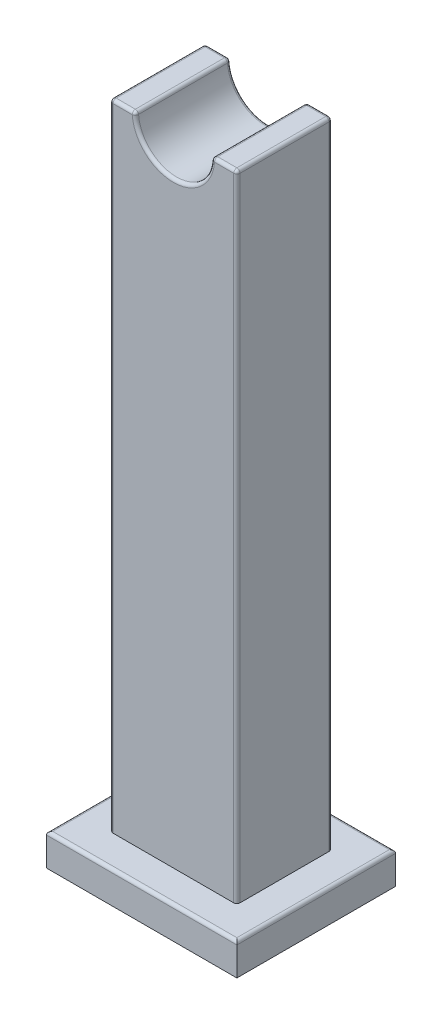
ISO-10303-21;
HEADER;
FILE_DESCRIPTION(('STEP AP214'),'2;1');
FILE_NAME('part.step','',(''),(''),'','','');
FILE_SCHEMA(('AUTOMOTIVE_DESIGN { 1 0 10303 214 1 1 1 1 }'));
ENDSEC;
DATA;
#1=APPLICATION_CONTEXT('core data for automotive mechanical design processes');
#2=APPLICATION_PROTOCOL_DEFINITION('international standard','automotive_design',2000,#1);
#3=PRODUCT_CONTEXT('',#1,'mechanical');
#4=PRODUCT('Part','Part','',(#3));
#5=PRODUCT_RELATED_PRODUCT_CATEGORY('part','',(#4));
#6=PRODUCT_DEFINITION_FORMATION('','',#4);
#7=PRODUCT_DEFINITION_CONTEXT('part definition',#1,'design');
#8=PRODUCT_DEFINITION('design','',#6,#7);
#9=PRODUCT_DEFINITION_SHAPE('','',#8);
#10=(LENGTH_UNIT() NAMED_UNIT(*) SI_UNIT(.MILLI.,.METRE.));
#11=(NAMED_UNIT(*) PLANE_ANGLE_UNIT() SI_UNIT($,.RADIAN.));
#12=(NAMED_UNIT(*) SI_UNIT($,.STERADIAN.) SOLID_ANGLE_UNIT());
#13=UNCERTAINTY_MEASURE_WITH_UNIT(LENGTH_MEASURE(1.E-05),#10,'distance_accuracy_value','');
#14=(GEOMETRIC_REPRESENTATION_CONTEXT(3) GLOBAL_UNCERTAINTY_ASSIGNED_CONTEXT((#13)) GLOBAL_UNIT_ASSIGNED_CONTEXT((#10,
#11,#12)) REPRESENTATION_CONTEXT('',''));
#15=CARTESIAN_POINT('',(0.,0.,0.));
#16=DIRECTION('',(0.,0.,1.));
#17=DIRECTION('',(1.,0.,0.));
#18=AXIS2_PLACEMENT_3D('',#15,#16,#17);
#19=CARTESIAN_POINT('',(-10.,0.,15.));
#20=DIRECTION('',(1.,0.,0.));
#21=DIRECTION('',(0.,1.,0.));
#22=AXIS2_PLACEMENT_3D('',#19,#20,#21);
#23=PLANE('',#22);
#24=DIRECTION('',(0.,0.,-1.));
#25=VECTOR('',#24,1.);
#26=CARTESIAN_POINT('',(-10.,-0.499999999999998,15.));
#27=LINE('',#26,#25);
#28=CARTESIAN_POINT('',(-10.,-0.499999999999998,14.5));
#29=VERTEX_POINT('',#28);
#30=CARTESIAN_POINT('',(-10.,-0.499999999999998,0.5));
#31=VERTEX_POINT('',#30);
#32=EDGE_CURVE('E242',#29,#31,#27,.T.);
#33=ORIENTED_EDGE('',*,*,#32,.T.);
#34=DIRECTION('',(0.,-1.,0.));
#35=VECTOR('',#34,1.);
#36=CARTESIAN_POINT('',(-10.,0.,0.5));
#37=LINE('',#36,#35);
#38=CARTESIAN_POINT('',(-9.99999999999999,-100.,0.5));
#39=VERTEX_POINT('',#38);
#40=EDGE_CURVE('E245',#31,#39,#37,.T.);
#41=ORIENTED_EDGE('',*,*,#40,.T.);
#42=DIRECTION('',(0.,0.,-1.));
#43=VECTOR('',#42,1.);
#44=CARTESIAN_POINT('',(-9.99999999999999,-100.,15.));
#45=LINE('',#44,#43);
#46=CARTESIAN_POINT('',(-9.99999999999999,-100.,14.5));
#47=VERTEX_POINT('',#46);
#48=EDGE_CURVE('E235',#47,#39,#45,.T.);
#49=ORIENTED_EDGE('',*,*,#48,.F.);
#50=DIRECTION('',(0.,-1.,0.));
#51=VECTOR('',#50,1.);
#52=CARTESIAN_POINT('',(-10.,0.,14.5));
#53=LINE('',#52,#51);
#54=EDGE_CURVE('E239',#47,#29,#53,.F.);
#55=ORIENTED_EDGE('',*,*,#54,.T.);
#56=EDGE_LOOP('',(#33,#41,#49,#55));
#57=FACE_BOUND('',#56,.T.);
#58=ADVANCED_FACE('F39',(#57),#23,.F.);
#59=CARTESIAN_POINT('',(10.,0.,15.));
#60=DIRECTION('',(-1.,0.,0.));
#61=DIRECTION('',(0.,-1.,0.));
#62=AXIS2_PLACEMENT_3D('',#59,#60,#61);
#63=PLANE('',#62);
#64=DIRECTION('',(0.,0.,-1.));
#65=VECTOR('',#64,1.);
#66=CARTESIAN_POINT('',(10.,-100.,15.));
#67=LINE('',#66,#65);
#68=CARTESIAN_POINT('',(10.,-100.,14.5));
#69=VERTEX_POINT('',#68);
#70=CARTESIAN_POINT('',(10.,-100.,0.5));
#71=VERTEX_POINT('',#70);
#72=EDGE_CURVE('E230',#69,#71,#67,.T.);
#73=ORIENTED_EDGE('',*,*,#72,.T.);
#74=DIRECTION('',(0.,1.,0.));
#75=VECTOR('',#74,1.);
#76=CARTESIAN_POINT('',(10.,0.,0.5));
#77=LINE('',#76,#75);
#78=CARTESIAN_POINT('',(10.,-0.499999999999998,0.5));
#79=VERTEX_POINT('',#78);
#80=EDGE_CURVE('E324',#71,#79,#77,.T.);
#81=ORIENTED_EDGE('',*,*,#80,.T.);
#82=DIRECTION('',(0.,0.,-1.));
#83=VECTOR('',#82,1.);
#84=CARTESIAN_POINT('',(10.,-0.499999999999998,15.));
#85=LINE('',#84,#83);
#86=CARTESIAN_POINT('',(10.,-0.499999999999998,14.5));
#87=VERTEX_POINT('',#86);
#88=EDGE_CURVE('E321',#79,#87,#85,.F.);
#89=ORIENTED_EDGE('',*,*,#88,.T.);
#90=DIRECTION('',(0.,1.,0.));
#91=VECTOR('',#90,1.);
#92=CARTESIAN_POINT('',(10.,-100.,14.5));
#93=LINE('',#92,#91);
#94=EDGE_CURVE('E318',#87,#69,#93,.F.);
#95=ORIENTED_EDGE('',*,*,#94,.T.);
#96=EDGE_LOOP('',(#73,#81,#89,#95));
#97=FACE_BOUND('',#96,.T.);
#98=ADVANCED_FACE('F487',(#97),#63,.F.);
#99=CARTESIAN_POINT('',(6.,0.,15.));
#100=DIRECTION('',(0.,-1.,0.));
#101=DIRECTION('',(0.,0.,-1.));
#102=AXIS2_PLACEMENT_3D('',#99,#100,#101);
#103=PLANE('',#102);
#104=DIRECTION('',(0.,0.,-1.));
#105=VECTOR('',#104,1.);
#106=CARTESIAN_POINT('',(9.5,0.,15.));
#107=LINE('',#106,#105);
#108=CARTESIAN_POINT('',(9.5,0.,14.5));
#109=VERTEX_POINT('',#108);
#110=CARTESIAN_POINT('',(9.5,0.,0.5));
#111=VERTEX_POINT('',#110);
#112=EDGE_CURVE('E267',#109,#111,#107,.T.);
#113=ORIENTED_EDGE('',*,*,#112,.T.);
#114=DIRECTION('',(-1.,0.,0.));
#115=VECTOR('',#114,1.);
#116=CARTESIAN_POINT('',(6.,0.,0.5));
#117=LINE('',#116,#115);
#118=CARTESIAN_POINT('',(6.48074069840786,0.,0.5));
#119=VERTEX_POINT('',#118);
#120=EDGE_CURVE('E273',#111,#119,#117,.T.);
#121=ORIENTED_EDGE('',*,*,#120,.T.);
#122=DIRECTION('',(0.,0.,-1.));
#123=VECTOR('',#122,1.);
#124=CARTESIAN_POINT('',(6.48074069840786,0.,15.));
#125=LINE('',#124,#123);
#126=CARTESIAN_POINT('',(6.48074069840786,0.,14.5));
#127=VERTEX_POINT('',#126);
#128=EDGE_CURVE('E270',#119,#127,#125,.F.);
#129=ORIENTED_EDGE('',*,*,#128,.T.);
#130=DIRECTION('',(-1.,0.,0.));
#131=VECTOR('',#130,1.);
#132=CARTESIAN_POINT('',(10.,0.,14.5));
#133=LINE('',#132,#131);
#134=EDGE_CURVE('E264',#127,#109,#133,.F.);
#135=ORIENTED_EDGE('',*,*,#134,.T.);
#136=EDGE_LOOP('',(#113,#121,#129,#135));
#137=FACE_BOUND('',#136,.T.);
#138=ADVANCED_FACE('F493',(#137),#103,.F.);
#139=CARTESIAN_POINT('',(0.,0.,15.));
#140=DIRECTION('',(0.,0.,-1.));
#141=DIRECTION('',(-1.,0.,0.));
#142=AXIS2_PLACEMENT_3D('',#139,#140,#141);
#143=CYLINDRICAL_SURFACE('',#142,6.);
#144=CARTESIAN_POINT('',(0.,0.,0.5));
#145=DIRECTION('',(0.,0.,1.));
#146=DIRECTION('',(1.,0.,0.));
#147=AXIS2_PLACEMENT_3D('',#144,#145,#146);
#148=CIRCLE('',#147,6.);
#149=CARTESIAN_POINT('',(5.98222218314572,-0.461538461538459,0.5));
#150=VERTEX_POINT('',#149);
#151=CARTESIAN_POINT('',(-5.98222218314572,-0.461538461538459,0.5));
#152=VERTEX_POINT('',#151);
#153=EDGE_CURVE('E311',#150,#152,#148,.F.);
#154=ORIENTED_EDGE('',*,*,#153,.T.);
#155=DIRECTION('',(0.,0.,-1.));
#156=VECTOR('',#155,1.);
#157=CARTESIAN_POINT('',(-5.98222218314572,-0.461538461538459,15.));
#158=LINE('',#157,#156);
#159=CARTESIAN_POINT('',(-5.98222218314572,-0.461538461538459,14.5));
#160=VERTEX_POINT('',#159);
#161=EDGE_CURVE('E314',#152,#160,#158,.F.);
#162=ORIENTED_EDGE('',*,*,#161,.T.);
#163=CARTESIAN_POINT('',(0.,0.,14.5));
#164=DIRECTION('',(0.,0.,1.));
#165=DIRECTION('',(1.,0.,0.));
#166=AXIS2_PLACEMENT_3D('',#163,#164,#165);
#167=CIRCLE('',#166,6.);
#168=CARTESIAN_POINT('',(5.98222218314572,-0.461538461538459,14.5));
#169=VERTEX_POINT('',#168);
#170=EDGE_CURVE('E305',#160,#169,#167,.T.);
#171=ORIENTED_EDGE('',*,*,#170,.T.);
#172=DIRECTION('',(0.,0.,-1.));
#173=VECTOR('',#172,1.);
#174=CARTESIAN_POINT('',(5.98222218314572,-0.461538461538459,15.));
#175=LINE('',#174,#173);
#176=EDGE_CURVE('E308',#169,#150,#175,.T.);
#177=ORIENTED_EDGE('',*,*,#176,.T.);
#178=EDGE_LOOP('',(#154,#162,#171,#177));
#179=FACE_BOUND('',#178,.T.);
#180=ADVANCED_FACE('F636',(#179),#143,.F.);
#181=CARTESIAN_POINT('',(-10.,0.,15.));
#182=DIRECTION('',(0.,-1.,0.));
#183=DIRECTION('',(0.,0.,-1.));
#184=AXIS2_PLACEMENT_3D('',#181,#182,#183);
#185=PLANE('',#184);
#186=DIRECTION('',(-1.,0.,0.));
#187=VECTOR('',#186,1.);
#188=CARTESIAN_POINT('',(-10.,0.,0.5));
#189=LINE('',#188,#187);
#190=CARTESIAN_POINT('',(-6.48074069840786,0.,0.5));
#191=VERTEX_POINT('',#190);
#192=CARTESIAN_POINT('',(-9.5,0.,0.5));
#193=VERTEX_POINT('',#192);
#194=EDGE_CURVE('E295',#191,#193,#189,.T.);
#195=ORIENTED_EDGE('',*,*,#194,.T.);
#196=DIRECTION('',(0.,0.,-1.));
#197=VECTOR('',#196,1.);
#198=CARTESIAN_POINT('',(-9.5,0.,15.));
#199=LINE('',#198,#197);
#200=CARTESIAN_POINT('',(-9.5,0.,14.5));
#201=VERTEX_POINT('',#200);
#202=EDGE_CURVE('E302',#193,#201,#199,.F.);
#203=ORIENTED_EDGE('',*,*,#202,.T.);
#204=DIRECTION('',(-1.,0.,0.));
#205=VECTOR('',#204,1.);
#206=CARTESIAN_POINT('',(-6.,0.,14.5));
#207=LINE('',#206,#205);
#208=CARTESIAN_POINT('',(-6.48074069840786,0.,14.5));
#209=VERTEX_POINT('',#208);
#210=EDGE_CURVE('E298',#201,#209,#207,.F.);
#211=ORIENTED_EDGE('',*,*,#210,.T.);
#212=DIRECTION('',(0.,0.,-1.));
#213=VECTOR('',#212,1.);
#214=CARTESIAN_POINT('',(-6.48074069840786,0.,15.));
#215=LINE('',#214,#213);
#216=EDGE_CURVE('E292',#209,#191,#215,.T.);
#217=ORIENTED_EDGE('',*,*,#216,.T.);
#218=EDGE_LOOP('',(#195,#203,#211,#217));
#219=FACE_BOUND('',#218,.T.);
#220=ADVANCED_FACE('F655',(#219),#185,.F.);
#221=CARTESIAN_POINT('',(0.,0.,15.));
#222=DIRECTION('',(0.,0.,1.));
#223=DIRECTION('',(1.,0.,0.));
#224=AXIS2_PLACEMENT_3D('',#221,#222,#223);
#225=PLANE('',#224);
#226=DIRECTION('',(-1.,0.,0.));
#227=VECTOR('',#226,1.);
#228=CARTESIAN_POINT('',(-10.,-0.499999999999998,15.));
#229=LINE('',#228,#227);
#230=CARTESIAN_POINT('',(-6.48074069840786,-0.499999999999998,15.));
#231=VERTEX_POINT('',#230);
#232=CARTESIAN_POINT('',(-9.5,-0.499999999999998,15.));
#233=VERTEX_POINT('',#232);
#234=EDGE_CURVE('E286',#231,#233,#229,.T.);
#235=ORIENTED_EDGE('',*,*,#234,.T.);
#236=DIRECTION('',(0.,-1.,0.));
#237=VECTOR('',#236,1.);
#238=CARTESIAN_POINT('',(-9.49999999999999,-100.,15.));
#239=LINE('',#238,#237);
#240=CARTESIAN_POINT('',(-9.49999999999999,-100.,15.));
#241=VERTEX_POINT('',#240);
#242=EDGE_CURVE('E289',#233,#241,#239,.T.);
#243=ORIENTED_EDGE('',*,*,#242,.T.);
#244=DIRECTION('',(1.,0.,0.));
#245=VECTOR('',#244,1.);
#246=CARTESIAN_POINT('',(-9.99999999999999,-100.,15.));
#247=LINE('',#246,#245);
#248=CARTESIAN_POINT('',(9.50000000000001,-100.,15.));
#249=VERTEX_POINT('',#248);
#250=EDGE_CURVE('E222',#241,#249,#247,.T.);
#251=ORIENTED_EDGE('',*,*,#250,.T.);
#252=DIRECTION('',(0.,1.,0.));
#253=VECTOR('',#252,1.);
#254=CARTESIAN_POINT('',(9.5,0.,15.));
#255=LINE('',#254,#253);
#256=CARTESIAN_POINT('',(9.5,-0.499999999999998,15.));
#257=VERTEX_POINT('',#256);
#258=EDGE_CURVE('E277',#249,#257,#255,.T.);
#259=ORIENTED_EDGE('',*,*,#258,.T.);
#260=DIRECTION('',(-1.,0.,0.));
#261=VECTOR('',#260,1.);
#262=CARTESIAN_POINT('',(6.,-0.499999999999998,15.));
#263=LINE('',#262,#261);
#264=CARTESIAN_POINT('',(6.48074069840786,-0.499999999999998,15.));
#265=VERTEX_POINT('',#264);
#266=EDGE_CURVE('E280',#257,#265,#263,.T.);
#267=ORIENTED_EDGE('',*,*,#266,.T.);
#268=CARTESIAN_POINT('',(0.,0.,15.));
#269=DIRECTION('',(0.,0.,1.));
#270=DIRECTION('',(1.,0.,0.));
#271=AXIS2_PLACEMENT_3D('',#268,#269,#270);
#272=CIRCLE('',#271,6.5);
#273=EDGE_CURVE('E283',#265,#231,#272,.F.);
#274=ORIENTED_EDGE('',*,*,#273,.T.);
#275=EDGE_LOOP('',(#235,#243,#251,#259,#267,#274));
#276=FACE_BOUND('',#275,.T.);
#277=ADVANCED_FACE('F601',(#276),#225,.T.);
#278=CARTESIAN_POINT('',(0.,0.,0.));
#279=DIRECTION('',(0.,0.,1.));
#280=DIRECTION('',(1.,0.,0.));
#281=AXIS2_PLACEMENT_3D('',#278,#279,#280);
#282=PLANE('',#281);
#283=DIRECTION('',(1.,0.,0.));
#284=VECTOR('',#283,1.);
#285=CARTESIAN_POINT('',(-9.99999999999999,-100.,0.));
#286=LINE('',#285,#284);
#287=CARTESIAN_POINT('',(-9.49999999999999,-100.,0.));
#288=VERTEX_POINT('',#287);
#289=CARTESIAN_POINT('',(9.50000000000001,-100.,0.));
#290=VERTEX_POINT('',#289);
#291=EDGE_CURVE('E217',#288,#290,#286,.T.);
#292=ORIENTED_EDGE('',*,*,#291,.F.);
#293=DIRECTION('',(0.,-1.,0.));
#294=VECTOR('',#293,1.);
#295=CARTESIAN_POINT('',(-9.5,0.,0.));
#296=LINE('',#295,#294);
#297=CARTESIAN_POINT('',(-9.5,-0.499999999999998,0.));
#298=VERTEX_POINT('',#297);
#299=EDGE_CURVE('E261',#288,#298,#296,.F.);
#300=ORIENTED_EDGE('',*,*,#299,.T.);
#301=DIRECTION('',(-1.,0.,0.));
#302=VECTOR('',#301,1.);
#303=CARTESIAN_POINT('',(0.,-0.499999999999998,0.));
#304=LINE('',#303,#302);
#305=CARTESIAN_POINT('',(-6.48074069840786,-0.499999999999998,0.));
#306=VERTEX_POINT('',#305);
#307=EDGE_CURVE('E258',#298,#306,#304,.F.);
#308=ORIENTED_EDGE('',*,*,#307,.T.);
#309=CARTESIAN_POINT('',(0.,0.,0.));
#310=DIRECTION('',(0.,0.,1.));
#311=DIRECTION('',(1.,0.,0.));
#312=AXIS2_PLACEMENT_3D('',#309,#310,#311);
#313=CIRCLE('',#312,6.5);
#314=CARTESIAN_POINT('',(6.48074069840786,-0.499999999999998,0.));
#315=VERTEX_POINT('',#314);
#316=EDGE_CURVE('E255',#306,#315,#313,.T.);
#317=ORIENTED_EDGE('',*,*,#316,.T.);
#318=DIRECTION('',(-1.,0.,0.));
#319=VECTOR('',#318,1.);
#320=CARTESIAN_POINT('',(0.,-0.499999999999998,0.));
#321=LINE('',#320,#319);
#322=CARTESIAN_POINT('',(9.5,-0.499999999999998,0.));
#323=VERTEX_POINT('',#322);
#324=EDGE_CURVE('E252',#315,#323,#321,.F.);
#325=ORIENTED_EDGE('',*,*,#324,.T.);
#326=DIRECTION('',(0.,1.,0.));
#327=VECTOR('',#326,1.);
#328=CARTESIAN_POINT('',(9.5,0.,0.));
#329=LINE('',#328,#327);
#330=EDGE_CURVE('E249',#323,#290,#329,.F.);
#331=ORIENTED_EDGE('',*,*,#330,.T.);
#332=EDGE_LOOP('',(#292,#300,#308,#317,#325,#331));
#333=FACE_BOUND('',#332,.T.);
#334=ADVANCED_FACE('F620',(#333),#282,.F.);
#335=CARTESIAN_POINT('',(-15.,-105.,20.));
#336=DIRECTION('',(1.,0.,0.));
#337=DIRECTION('',(0.,0.,-1.));
#338=AXIS2_PLACEMENT_3D('',#335,#336,#337);
#339=PLANE('',#338);
#340=DIRECTION('',(0.,1.,0.));
#341=VECTOR('',#340,1.);
#342=CARTESIAN_POINT('',(-15.,-105.,20.));
#343=LINE('',#342,#341);
#344=CARTESIAN_POINT('',(-15.,-105.,20.));
#345=VERTEX_POINT('',#344);
#346=CARTESIAN_POINT('',(-15.,-100.5,20.));
#347=VERTEX_POINT('',#346);
#348=EDGE_CURVE('E908',#345,#347,#343,.T.);
#349=ORIENTED_EDGE('',*,*,#348,.T.);
#350=DIRECTION('',(0.,0.,-1.));
#351=VECTOR('',#350,1.);
#352=CARTESIAN_POINT('',(-15.,-100.5,20.));
#353=LINE('',#352,#351);
#354=CARTESIAN_POINT('',(-15.,-100.5,-5.));
#355=VERTEX_POINT('',#354);
#356=EDGE_CURVE('E215',#347,#355,#353,.T.);
#357=ORIENTED_EDGE('',*,*,#356,.T.);
#358=DIRECTION('',(0.,1.,0.));
#359=VECTOR('',#358,1.);
#360=CARTESIAN_POINT('',(-15.,-105.,-5.));
#361=LINE('',#360,#359);
#362=CARTESIAN_POINT('',(-15.,-105.,-5.));
#363=VERTEX_POINT('',#362);
#364=EDGE_CURVE('E194',#363,#355,#361,.T.);
#365=ORIENTED_EDGE('',*,*,#364,.F.);
#366=DIRECTION('',(0.,0.,-1.));
#367=VECTOR('',#366,1.);
#368=CARTESIAN_POINT('',(-15.,-105.,20.));
#369=LINE('',#368,#367);
#370=EDGE_CURVE('E200',#345,#363,#369,.T.);
#371=ORIENTED_EDGE('',*,*,#370,.F.);
#372=EDGE_LOOP('',(#349,#357,#365,#371));
#373=FACE_BOUND('',#372,.T.);
#374=ADVANCED_FACE('F213',(#373),#339,.F.);
#375=CARTESIAN_POINT('',(-15.,-105.,-5.));
#376=DIRECTION('',(0.,0.,1.));
#377=DIRECTION('',(1.,0.,0.));
#378=AXIS2_PLACEMENT_3D('',#375,#376,#377);
#379=PLANE('',#378);
#380=ORIENTED_EDGE('',*,*,#364,.T.);
#381=DIRECTION('',(1.,0.,0.));
#382=VECTOR('',#381,1.);
#383=CARTESIAN_POINT('',(-15.,-100.5,-5.));
#384=LINE('',#383,#382);
#385=CARTESIAN_POINT('',(15.,-100.5,-5.));
#386=VERTEX_POINT('',#385);
#387=EDGE_CURVE('E65',#355,#386,#384,.T.);
#388=ORIENTED_EDGE('',*,*,#387,.T.);
#389=DIRECTION('',(0.,1.,0.));
#390=VECTOR('',#389,1.);
#391=CARTESIAN_POINT('',(15.,-105.,-5.));
#392=LINE('',#391,#390);
#393=CARTESIAN_POINT('',(15.,-105.,-5.));
#394=VERTEX_POINT('',#393);
#395=EDGE_CURVE('E195',#394,#386,#392,.T.);
#396=ORIENTED_EDGE('',*,*,#395,.F.);
#397=DIRECTION('',(1.,0.,0.));
#398=VECTOR('',#397,1.);
#399=CARTESIAN_POINT('',(-15.,-105.,-5.));
#400=LINE('',#399,#398);
#401=EDGE_CURVE('E190',#363,#394,#400,.T.);
#402=ORIENTED_EDGE('',*,*,#401,.F.);
#403=EDGE_LOOP('',(#380,#388,#396,#402));
#404=FACE_BOUND('',#403,.T.);
#405=ADVANCED_FACE('F192',(#404),#379,.F.);
#406=CARTESIAN_POINT('',(15.,-105.,20.));
#407=DIRECTION('',(-1.,0.,0.));
#408=DIRECTION('',(0.,0.,1.));
#409=AXIS2_PLACEMENT_3D('',#406,#407,#408);
#410=PLANE('',#409);
#411=ORIENTED_EDGE('',*,*,#395,.T.);
#412=DIRECTION('',(0.,0.,1.));
#413=VECTOR('',#412,1.);
#414=CARTESIAN_POINT('',(15.,-100.5,20.));
#415=LINE('',#414,#413);
#416=CARTESIAN_POINT('',(15.,-100.5,20.));
#417=VERTEX_POINT('',#416);
#418=EDGE_CURVE('E57',#386,#417,#415,.T.);
#419=ORIENTED_EDGE('',*,*,#418,.T.);
#420=DIRECTION('',(0.,1.,0.));
#421=VECTOR('',#420,1.);
#422=CARTESIAN_POINT('',(15.,-105.,20.));
#423=LINE('',#422,#421);
#424=CARTESIAN_POINT('',(15.,-105.,20.));
#425=VERTEX_POINT('',#424);
#426=EDGE_CURVE('E224',#425,#417,#423,.T.);
#427=ORIENTED_EDGE('',*,*,#426,.F.);
#428=DIRECTION('',(0.,0.,1.));
#429=VECTOR('',#428,1.);
#430=CARTESIAN_POINT('',(15.,-105.,20.));
#431=LINE('',#430,#429);
#432=EDGE_CURVE('E199',#394,#425,#431,.T.);
#433=ORIENTED_EDGE('',*,*,#432,.F.);
#434=EDGE_LOOP('',(#411,#419,#427,#433));
#435=FACE_BOUND('',#434,.T.);
#436=ADVANCED_FACE('F708',(#435),#410,.F.);
#437=CARTESIAN_POINT('',(-15.,-105.,20.));
#438=DIRECTION('',(0.,0.,-1.));
#439=DIRECTION('',(-1.,0.,0.));
#440=AXIS2_PLACEMENT_3D('',#437,#438,#439);
#441=PLANE('',#440);
#442=ORIENTED_EDGE('',*,*,#426,.T.);
#443=DIRECTION('',(-1.,0.,0.));
#444=VECTOR('',#443,1.);
#445=CARTESIAN_POINT('',(-15.,-100.5,20.));
#446=LINE('',#445,#444);
#447=EDGE_CURVE('E346',#417,#347,#446,.T.);
#448=ORIENTED_EDGE('',*,*,#447,.T.);
#449=ORIENTED_EDGE('',*,*,#348,.F.);
#450=DIRECTION('',(-1.,0.,0.));
#451=VECTOR('',#450,1.);
#452=CARTESIAN_POINT('',(-15.,-105.,20.));
#453=LINE('',#452,#451);
#454=EDGE_CURVE('E205',#425,#345,#453,.T.);
#455=ORIENTED_EDGE('',*,*,#454,.F.);
#456=EDGE_LOOP('',(#442,#448,#449,#455));
#457=FACE_BOUND('',#456,.T.);
#458=ADVANCED_FACE('F717',(#457),#441,.F.);
#459=CARTESIAN_POINT('',(0.,-105.,0.));
#460=DIRECTION('',(0.,-1.,0.));
#461=DIRECTION('',(0.,0.,-1.));
#462=AXIS2_PLACEMENT_3D('',#459,#460,#461);
#463=PLANE('',#462);
#464=ORIENTED_EDGE('',*,*,#370,.T.);
#465=ORIENTED_EDGE('',*,*,#401,.T.);
#466=ORIENTED_EDGE('',*,*,#432,.T.);
#467=ORIENTED_EDGE('',*,*,#454,.T.);
#468=EDGE_LOOP('',(#464,#465,#466,#467));
#469=FACE_BOUND('',#468,.T.);
#470=ADVANCED_FACE('F203',(#469),#463,.T.);
#471=CARTESIAN_POINT('',(0.,-100.,0.));
#472=DIRECTION('',(0.,-1.,0.));
#473=DIRECTION('',(0.,0.,-1.));
#474=AXIS2_PLACEMENT_3D('',#471,#472,#473);
#475=PLANE('',#474);
#476=DIRECTION('',(1.,0.,0.));
#477=VECTOR('',#476,1.);
#478=CARTESIAN_POINT('',(0.,-100.,-4.5));
#479=LINE('',#478,#477);
#480=CARTESIAN_POINT('',(14.5,-100.,-4.5));
#481=VERTEX_POINT('',#480);
#482=CARTESIAN_POINT('',(-14.5,-100.,-4.5));
#483=VERTEX_POINT('',#482);
#484=EDGE_CURVE('E335',#481,#483,#479,.F.);
#485=ORIENTED_EDGE('',*,*,#484,.T.);
#486=DIRECTION('',(0.,0.,-1.));
#487=VECTOR('',#486,1.);
#488=CARTESIAN_POINT('',(-14.5,-100.,0.));
#489=LINE('',#488,#487);
#490=CARTESIAN_POINT('',(-14.5,-100.,19.5));
#491=VERTEX_POINT('',#490);
#492=EDGE_CURVE('E338',#483,#491,#489,.F.);
#493=ORIENTED_EDGE('',*,*,#492,.T.);
#494=DIRECTION('',(-1.,0.,0.));
#495=VECTOR('',#494,1.);
#496=CARTESIAN_POINT('',(0.,-100.,19.5));
#497=LINE('',#496,#495);
#498=CARTESIAN_POINT('',(14.5,-100.,19.5));
#499=VERTEX_POINT('',#498);
#500=EDGE_CURVE('E329',#491,#499,#497,.F.);
#501=ORIENTED_EDGE('',*,*,#500,.T.);
#502=DIRECTION('',(0.,0.,1.));
#503=VECTOR('',#502,1.);
#504=CARTESIAN_POINT('',(14.5,-100.,0.));
#505=LINE('',#504,#503);
#506=EDGE_CURVE('E332',#499,#481,#505,.F.);
#507=ORIENTED_EDGE('',*,*,#506,.T.);
#508=EDGE_LOOP('',(#485,#493,#501,#507));
#509=FACE_BOUND('',#508,.T.);
#510=ORIENTED_EDGE('',*,*,#250,.F.);
#511=CARTESIAN_POINT('',(-9.49999999999999,-100.,14.5));
#512=DIRECTION('',(0.,-1.,0.));
#513=DIRECTION('',(0.,0.,-1.));
#514=AXIS2_PLACEMENT_3D('',#511,#512,#513);
#515=CIRCLE('',#514,0.5);
#516=EDGE_CURVE('E352',#241,#47,#515,.T.);
#517=ORIENTED_EDGE('',*,*,#516,.T.);
#518=ORIENTED_EDGE('',*,*,#48,.T.);
#519=CARTESIAN_POINT('',(-9.49999999999999,-100.,0.5));
#520=DIRECTION('',(0.,-1.,0.));
#521=DIRECTION('',(0.,0.,-1.));
#522=AXIS2_PLACEMENT_3D('',#519,#520,#521);
#523=CIRCLE('',#522,0.5);
#524=EDGE_CURVE('E349',#39,#288,#523,.T.);
#525=ORIENTED_EDGE('',*,*,#524,.T.);
#526=ORIENTED_EDGE('',*,*,#291,.T.);
#527=CARTESIAN_POINT('',(9.50000000000001,-100.,0.5));
#528=DIRECTION('',(0.,-1.,0.));
#529=DIRECTION('',(0.,0.,-1.));
#530=AXIS2_PLACEMENT_3D('',#527,#528,#529);
#531=CIRCLE('',#530,0.5);
#532=EDGE_CURVE('E49',#290,#71,#531,.T.);
#533=ORIENTED_EDGE('',*,*,#532,.T.);
#534=ORIENTED_EDGE('',*,*,#72,.F.);
#535=CARTESIAN_POINT('',(9.50000000000001,-100.,14.5));
#536=DIRECTION('',(0.,-1.,0.));
#537=DIRECTION('',(0.,0.,-1.));
#538=AXIS2_PLACEMENT_3D('',#535,#536,#537);
#539=CIRCLE('',#538,0.5);
#540=EDGE_CURVE('E11',#69,#249,#539,.T.);
#541=ORIENTED_EDGE('',*,*,#540,.T.);
#542=EDGE_LOOP('',(#510,#517,#518,#525,#526,#533,#534,#541));
#543=FACE_BOUND('',#542,.T.);
#544=ADVANCED_FACE('F472',(#509,#543),#475,.F.);
#545=CARTESIAN_POINT('',(9.5,0.,14.5));
#546=DIRECTION('',(0.,-1.,0.));
#547=DIRECTION('',(1.,0.,0.));
#548=AXIS2_PLACEMENT_3D('',#545,#546,#547);
#549=CYLINDRICAL_SURFACE('',#548,0.5);
#550=CARTESIAN_POINT('',(9.5,-0.499999999999998,14.5));
#551=DIRECTION('',(0.,1.,0.));
#552=DIRECTION('',(-1.,0.,0.));
#553=AXIS2_PLACEMENT_3D('',#550,#551,#552);
#554=CIRCLE('',#553,0.5);
#555=EDGE_CURVE('E210',#257,#87,#554,.T.);
#556=ORIENTED_EDGE('',*,*,#555,.F.);
#557=ORIENTED_EDGE('',*,*,#258,.F.);
#558=ORIENTED_EDGE('',*,*,#540,.F.);
#559=ORIENTED_EDGE('',*,*,#94,.F.);
#560=EDGE_LOOP('',(#556,#557,#558,#559));
#561=FACE_BOUND('',#560,.T.);
#562=ADVANCED_FACE('F581',(#561),#549,.T.);
#563=CARTESIAN_POINT('',(9.5,-0.499999999999998,14.5));
#564=DIRECTION('',(0.,0.,1.));
#565=DIRECTION('',(1.,0.,0.));
#566=AXIS2_PLACEMENT_3D('',#563,#564,#565);
#567=SPHERICAL_SURFACE('',#566,0.5);
#568=CARTESIAN_POINT('',(9.5,-0.499999999999998,14.5));
#569=DIRECTION('',(1.,0.,0.));
#570=DIRECTION('',(0.,0.,-1.));
#571=AXIS2_PLACEMENT_3D('',#568,#569,#570);
#572=CIRCLE('',#571,0.5);
#573=EDGE_CURVE('E439',#257,#109,#572,.F.);
#574=ORIENTED_EDGE('',*,*,#573,.F.);
#575=ORIENTED_EDGE('',*,*,#555,.T.);
#576=CARTESIAN_POINT('',(9.5,-0.499999999999998,14.5));
#577=DIRECTION('',(0.,0.,1.));
#578=DIRECTION('',(1.,0.,0.));
#579=AXIS2_PLACEMENT_3D('',#576,#577,#578);
#580=CIRCLE('',#579,0.5);
#581=EDGE_CURVE('E443',#109,#87,#580,.F.);
#582=ORIENTED_EDGE('',*,*,#581,.F.);
#583=EDGE_LOOP('',(#574,#575,#582));
#584=FACE_BOUND('',#583,.T.);
#585=ADVANCED_FACE('F577',(#584),#567,.T.);
#586=CARTESIAN_POINT('',(9.5,0.,0.5));
#587=DIRECTION('',(0.,1.,0.));
#588=DIRECTION('',(-1.,0.,0.));
#589=AXIS2_PLACEMENT_3D('',#586,#587,#588);
#590=CYLINDRICAL_SURFACE('',#589,0.5);
#591=ORIENTED_EDGE('',*,*,#532,.F.);
#592=ORIENTED_EDGE('',*,*,#330,.F.);
#593=CARTESIAN_POINT('',(9.5,-0.499999999999998,0.5));
#594=DIRECTION('',(0.,1.,0.));
#595=DIRECTION('',(-1.,0.,0.));
#596=AXIS2_PLACEMENT_3D('',#593,#594,#595);
#597=CIRCLE('',#596,0.5);
#598=EDGE_CURVE('E435',#79,#323,#597,.T.);
#599=ORIENTED_EDGE('',*,*,#598,.F.);
#600=ORIENTED_EDGE('',*,*,#80,.F.);
#601=EDGE_LOOP('',(#591,#592,#599,#600));
#602=FACE_BOUND('',#601,.T.);
#603=ADVANCED_FACE('F573',(#602),#590,.T.);
#604=CARTESIAN_POINT('',(9.5,-0.499999999999998,15.));
#605=DIRECTION('',(0.,0.,-1.));
#606=DIRECTION('',(-1.,0.,0.));
#607=AXIS2_PLACEMENT_3D('',#604,#605,#606);
#608=CYLINDRICAL_SURFACE('',#607,0.5);
#609=ORIENTED_EDGE('',*,*,#581,.T.);
#610=ORIENTED_EDGE('',*,*,#88,.F.);
#611=CARTESIAN_POINT('',(9.5,-0.499999999999998,0.5));
#612=DIRECTION('',(0.,0.,-1.));
#613=DIRECTION('',(-1.,0.,0.));
#614=AXIS2_PLACEMENT_3D('',#611,#612,#613);
#615=CIRCLE('',#614,0.5);
#616=EDGE_CURVE('E431',#111,#79,#615,.T.);
#617=ORIENTED_EDGE('',*,*,#616,.F.);
#618=ORIENTED_EDGE('',*,*,#112,.F.);
#619=EDGE_LOOP('',(#609,#610,#617,#618));
#620=FACE_BOUND('',#619,.T.);
#621=ADVANCED_FACE('F569',(#620),#608,.T.);
#622=CARTESIAN_POINT('',(0.,-0.499999999999998,14.5));
#623=DIRECTION('',(1.,0.,0.));
#624=DIRECTION('',(0.,0.,-1.));
#625=AXIS2_PLACEMENT_3D('',#622,#623,#624);
#626=CYLINDRICAL_SURFACE('',#625,0.5);
#627=ORIENTED_EDGE('',*,*,#573,.T.);
#628=ORIENTED_EDGE('',*,*,#134,.F.);
#629=CARTESIAN_POINT('',(6.48074069840786,-0.499999999999998,14.5));
#630=DIRECTION('',(-1.,0.,0.));
#631=DIRECTION('',(0.,-1.,0.));
#632=AXIS2_PLACEMENT_3D('',#629,#630,#631);
#633=CIRCLE('',#632,0.5);
#634=EDGE_CURVE('E427',#265,#127,#633,.T.);
#635=ORIENTED_EDGE('',*,*,#634,.F.);
#636=ORIENTED_EDGE('',*,*,#266,.F.);
#637=EDGE_LOOP('',(#627,#628,#635,#636));
#638=FACE_BOUND('',#637,.T.);
#639=ADVANCED_FACE('F565',(#638),#626,.T.);
#640=CARTESIAN_POINT('',(9.5,-0.499999999999998,0.5));
#641=DIRECTION('',(0.,0.,1.));
#642=DIRECTION('',(1.,0.,0.));
#643=AXIS2_PLACEMENT_3D('',#640,#641,#642);
#644=SPHERICAL_SURFACE('',#643,0.5);
#645=ORIENTED_EDGE('',*,*,#616,.T.);
#646=ORIENTED_EDGE('',*,*,#598,.T.);
#647=CARTESIAN_POINT('',(9.5,-0.499999999999998,0.5));
#648=DIRECTION('',(1.,0.,0.));
#649=DIRECTION('',(0.,0.,-1.));
#650=AXIS2_PLACEMENT_3D('',#647,#648,#649);
#651=CIRCLE('',#650,0.5);
#652=EDGE_CURVE('E423',#111,#323,#651,.F.);
#653=ORIENTED_EDGE('',*,*,#652,.F.);
#654=EDGE_LOOP('',(#645,#646,#653));
#655=FACE_BOUND('',#654,.T.);
#656=ADVANCED_FACE('F561',(#655),#644,.T.);
#657=CARTESIAN_POINT('',(6.48074069840786,-0.499999999999998,14.5));
#658=DIRECTION('',(0.,0.,1.));
#659=DIRECTION('',(1.,0.,0.));
#660=AXIS2_PLACEMENT_3D('',#657,#658,#659);
#661=SPHERICAL_SURFACE('',#660,0.5);
#662=CARTESIAN_POINT('',(6.48074069840786,-0.499999999999998,14.5));
#663=DIRECTION('',(0.0769230769230766,0.997037030524286,0.));
#664=DIRECTION('',(-0.997037030524286,0.0769230769230766,0.));
#665=AXIS2_PLACEMENT_3D('',#662,#663,#664);
#666=CIRCLE('',#665,0.5);
#667=EDGE_CURVE('E415',#265,#169,#666,.F.);
#668=ORIENTED_EDGE('',*,*,#667,.F.);
#669=ORIENTED_EDGE('',*,*,#634,.T.);
#670=CARTESIAN_POINT('',(6.48074069840786,-0.499999999999998,14.5));
#671=DIRECTION('',(0.,0.,1.));
#672=DIRECTION('',(1.,0.,0.));
#673=AXIS2_PLACEMENT_3D('',#670,#671,#672);
#674=CIRCLE('',#673,0.5);
#675=EDGE_CURVE('E419',#169,#127,#674,.F.);
#676=ORIENTED_EDGE('',*,*,#675,.F.);
#677=EDGE_LOOP('',(#668,#669,#676));
#678=FACE_BOUND('',#677,.T.);
#679=ADVANCED_FACE('F557',(#678),#661,.T.);
#680=CARTESIAN_POINT('',(6.,-0.499999999999998,0.5));
#681=DIRECTION('',(-1.,0.,0.));
#682=DIRECTION('',(0.,0.,1.));
#683=AXIS2_PLACEMENT_3D('',#680,#681,#682);
#684=CYLINDRICAL_SURFACE('',#683,0.5);
#685=ORIENTED_EDGE('',*,*,#652,.T.);
#686=ORIENTED_EDGE('',*,*,#324,.F.);
#687=CARTESIAN_POINT('',(6.48074069840786,-0.499999999999998,0.5));
#688=DIRECTION('',(-1.,0.,0.));
#689=DIRECTION('',(0.,0.,1.));
#690=AXIS2_PLACEMENT_3D('',#687,#688,#689);
#691=CIRCLE('',#690,0.5);
#692=EDGE_CURVE('E411',#119,#315,#691,.T.);
#693=ORIENTED_EDGE('',*,*,#692,.F.);
#694=ORIENTED_EDGE('',*,*,#120,.F.);
#695=EDGE_LOOP('',(#685,#686,#693,#694));
#696=FACE_BOUND('',#695,.T.);
#697=ADVANCED_FACE('F553',(#696),#684,.T.);
#698=CARTESIAN_POINT('',(6.48074069840786,-0.499999999999998,15.));
#699=DIRECTION('',(0.,0.,-1.));
#700=DIRECTION('',(-1.,0.,0.));
#701=AXIS2_PLACEMENT_3D('',#698,#699,#700);
#702=CYLINDRICAL_SURFACE('',#701,0.5);
#703=ORIENTED_EDGE('',*,*,#675,.T.);
#704=ORIENTED_EDGE('',*,*,#128,.F.);
#705=CARTESIAN_POINT('',(6.48074069840786,-0.499999999999998,0.5));
#706=DIRECTION('',(0.,0.,-1.));
#707=DIRECTION('',(-1.,0.,0.));
#708=AXIS2_PLACEMENT_3D('',#705,#706,#707);
#709=CIRCLE('',#708,0.5);
#710=EDGE_CURVE('E408',#150,#119,#709,.T.);
#711=ORIENTED_EDGE('',*,*,#710,.F.);
#712=ORIENTED_EDGE('',*,*,#176,.F.);
#713=EDGE_LOOP('',(#703,#704,#711,#712));
#714=FACE_BOUND('',#713,.T.);
#715=ADVANCED_FACE('F549',(#714),#702,.T.);
#716=CARTESIAN_POINT('',(0.,0.,14.5));
#717=DIRECTION('',(0.,0.,1.));
#718=DIRECTION('',(1.,0.,0.));
#719=AXIS2_PLACEMENT_3D('',#716,#717,#718);
#720=TOROIDAL_SURFACE('',#719,6.5,0.5);
#721=ORIENTED_EDGE('',*,*,#667,.T.);
#722=ORIENTED_EDGE('',*,*,#170,.F.);
#723=CARTESIAN_POINT('',(-6.48074069840786,-0.499999999999998,14.5));
#724=DIRECTION('',(-0.0769230769230765,0.997037030524286,0.));
#725=DIRECTION('',(-0.997037030524286,-0.0769230769230765,0.));
#726=AXIS2_PLACEMENT_3D('',#723,#724,#725);
#727=CIRCLE('',#726,0.5);
#728=EDGE_CURVE('E404',#231,#160,#727,.T.);
#729=ORIENTED_EDGE('',*,*,#728,.F.);
#730=ORIENTED_EDGE('',*,*,#273,.F.);
#731=EDGE_LOOP('',(#721,#722,#729,#730));
#732=FACE_BOUND('',#731,.T.);
#733=ADVANCED_FACE('F545',(#732),#720,.T.);
#734=CARTESIAN_POINT('',(6.48074069840786,-0.499999999999998,0.5));
#735=DIRECTION('',(0.,0.,1.));
#736=DIRECTION('',(1.,0.,0.));
#737=AXIS2_PLACEMENT_3D('',#734,#735,#736);
#738=SPHERICAL_SURFACE('',#737,0.5);
#739=ORIENTED_EDGE('',*,*,#710,.T.);
#740=ORIENTED_EDGE('',*,*,#692,.T.);
#741=CARTESIAN_POINT('',(6.48074069840786,-0.499999999999998,0.5));
#742=DIRECTION('',(0.0769230769230765,0.997037030524286,0.));
#743=DIRECTION('',(-0.997037030524286,0.0769230769230765,0.));
#744=AXIS2_PLACEMENT_3D('',#741,#742,#743);
#745=CIRCLE('',#744,0.5);
#746=EDGE_CURVE('E400',#150,#315,#745,.F.);
#747=ORIENTED_EDGE('',*,*,#746,.F.);
#748=EDGE_LOOP('',(#739,#740,#747));
#749=FACE_BOUND('',#748,.T.);
#750=ADVANCED_FACE('F541',(#749),#738,.T.);
#751=CARTESIAN_POINT('',(-6.48074069840786,-0.499999999999998,14.5));
#752=DIRECTION('',(0.,0.,1.));
#753=DIRECTION('',(1.,0.,0.));
#754=AXIS2_PLACEMENT_3D('',#751,#752,#753);
#755=SPHERICAL_SURFACE('',#754,0.5);
#756=CARTESIAN_POINT('',(-6.48074069840786,-0.499999999999998,14.5));
#757=DIRECTION('',(1.,0.,0.));
#758=DIRECTION('',(0.,0.,-1.));
#759=AXIS2_PLACEMENT_3D('',#756,#757,#758);
#760=CIRCLE('',#759,0.5);
#761=EDGE_CURVE('E393',#231,#209,#760,.F.);
#762=ORIENTED_EDGE('',*,*,#761,.F.);
#763=ORIENTED_EDGE('',*,*,#728,.T.);
#764=CARTESIAN_POINT('',(-6.48074069840786,-0.499999999999998,14.5));
#765=DIRECTION('',(0.,0.,1.));
#766=DIRECTION('',(1.,0.,0.));
#767=AXIS2_PLACEMENT_3D('',#764,#765,#766);
#768=CIRCLE('',#767,0.5);
#769=EDGE_CURVE('E397',#209,#160,#768,.F.);
#770=ORIENTED_EDGE('',*,*,#769,.F.);
#771=EDGE_LOOP('',(#762,#763,#770));
#772=FACE_BOUND('',#771,.T.);
#773=ADVANCED_FACE('F537',(#772),#755,.T.);
#774=CARTESIAN_POINT('',(0.,0.,0.5));
#775=DIRECTION('',(0.,0.,1.));
#776=DIRECTION('',(1.,0.,0.));
#777=AXIS2_PLACEMENT_3D('',#774,#775,#776);
#778=TOROIDAL_SURFACE('',#777,6.5,0.5);
#779=ORIENTED_EDGE('',*,*,#746,.T.);
#780=ORIENTED_EDGE('',*,*,#316,.F.);
#781=CARTESIAN_POINT('',(-6.48074069840786,-0.499999999999998,0.5));
#782=DIRECTION('',(-0.0769230769230766,0.997037030524286,0.));
#783=DIRECTION('',(-0.997037030524286,-0.0769230769230766,0.));
#784=AXIS2_PLACEMENT_3D('',#781,#782,#783);
#785=CIRCLE('',#784,0.5);
#786=EDGE_CURVE('E389',#152,#306,#785,.T.);
#787=ORIENTED_EDGE('',*,*,#786,.F.);
#788=ORIENTED_EDGE('',*,*,#153,.F.);
#789=EDGE_LOOP('',(#779,#780,#787,#788));
#790=FACE_BOUND('',#789,.T.);
#791=ADVANCED_FACE('F533',(#790),#778,.T.);
#792=CARTESIAN_POINT('',(-6.48074069840786,-0.499999999999998,15.));
#793=DIRECTION('',(0.,0.,-1.));
#794=DIRECTION('',(-1.,0.,0.));
#795=AXIS2_PLACEMENT_3D('',#792,#793,#794);
#796=CYLINDRICAL_SURFACE('',#795,0.5);
#797=ORIENTED_EDGE('',*,*,#769,.T.);
#798=ORIENTED_EDGE('',*,*,#161,.F.);
#799=CARTESIAN_POINT('',(-6.48074069840786,-0.499999999999998,0.5));
#800=DIRECTION('',(0.,0.,-1.));
#801=DIRECTION('',(-1.,0.,0.));
#802=AXIS2_PLACEMENT_3D('',#799,#800,#801);
#803=CIRCLE('',#802,0.5);
#804=EDGE_CURVE('E385',#191,#152,#803,.T.);
#805=ORIENTED_EDGE('',*,*,#804,.F.);
#806=ORIENTED_EDGE('',*,*,#216,.F.);
#807=EDGE_LOOP('',(#797,#798,#805,#806));
#808=FACE_BOUND('',#807,.T.);
#809=ADVANCED_FACE('F529',(#808),#796,.T.);
#810=CARTESIAN_POINT('',(0.,-0.499999999999998,14.5));
#811=DIRECTION('',(1.,0.,0.));
#812=DIRECTION('',(0.,0.,-1.));
#813=AXIS2_PLACEMENT_3D('',#810,#811,#812);
#814=CYLINDRICAL_SURFACE('',#813,0.5);
#815=ORIENTED_EDGE('',*,*,#761,.T.);
#816=ORIENTED_EDGE('',*,*,#210,.F.);
#817=CARTESIAN_POINT('',(-9.5,-0.499999999999998,14.5));
#818=DIRECTION('',(-1.,0.,0.));
#819=DIRECTION('',(0.,0.,1.));
#820=AXIS2_PLACEMENT_3D('',#817,#818,#819);
#821=CIRCLE('',#820,0.5);
#822=EDGE_CURVE('E381',#233,#201,#821,.T.);
#823=ORIENTED_EDGE('',*,*,#822,.F.);
#824=ORIENTED_EDGE('',*,*,#234,.F.);
#825=EDGE_LOOP('',(#815,#816,#823,#824));
#826=FACE_BOUND('',#825,.T.);
#827=ADVANCED_FACE('F525',(#826),#814,.T.);
#828=CARTESIAN_POINT('',(-9.5,0.,14.5));
#829=DIRECTION('',(0.,1.,0.));
#830=DIRECTION('',(-1.,0.,0.));
#831=AXIS2_PLACEMENT_3D('',#828,#829,#830);
#832=CYLINDRICAL_SURFACE('',#831,0.5);
#833=ORIENTED_EDGE('',*,*,#516,.F.);
#834=ORIENTED_EDGE('',*,*,#242,.F.);
#835=CARTESIAN_POINT('',(-9.5,-0.499999999999998,14.5));
#836=DIRECTION('',(0.,1.,0.));
#837=DIRECTION('',(-1.,0.,0.));
#838=AXIS2_PLACEMENT_3D('',#835,#836,#837);
#839=CIRCLE('',#838,0.5);
#840=EDGE_CURVE('E377',#29,#233,#839,.T.);
#841=ORIENTED_EDGE('',*,*,#840,.F.);
#842=ORIENTED_EDGE('',*,*,#54,.F.);
#843=EDGE_LOOP('',(#833,#834,#841,#842));
#844=FACE_BOUND('',#843,.T.);
#845=ADVANCED_FACE('F521',(#844),#832,.T.);
#846=CARTESIAN_POINT('',(-6.48074069840786,-0.499999999999998,0.5));
#847=DIRECTION('',(0.,0.,1.));
#848=DIRECTION('',(1.,0.,0.));
#849=AXIS2_PLACEMENT_3D('',#846,#847,#848);
#850=SPHERICAL_SURFACE('',#849,0.5);
#851=ORIENTED_EDGE('',*,*,#804,.T.);
#852=ORIENTED_EDGE('',*,*,#786,.T.);
#853=CARTESIAN_POINT('',(-6.48074069840786,-0.499999999999998,0.5));
#854=DIRECTION('',(1.,0.,0.));
#855=DIRECTION('',(0.,0.,-1.));
#856=AXIS2_PLACEMENT_3D('',#853,#854,#855);
#857=CIRCLE('',#856,0.5);
#858=EDGE_CURVE('E373',#191,#306,#857,.F.);
#859=ORIENTED_EDGE('',*,*,#858,.F.);
#860=EDGE_LOOP('',(#851,#852,#859));
#861=FACE_BOUND('',#860,.T.);
#862=ADVANCED_FACE('F517',(#861),#850,.T.);
#863=CARTESIAN_POINT('',(-9.5,-0.499999999999998,14.5));
#864=DIRECTION('',(0.,0.,1.));
#865=DIRECTION('',(1.,0.,0.));
#866=AXIS2_PLACEMENT_3D('',#863,#864,#865);
#867=SPHERICAL_SURFACE('',#866,0.5);
#868=ORIENTED_EDGE('',*,*,#840,.T.);
#869=ORIENTED_EDGE('',*,*,#822,.T.);
#870=CARTESIAN_POINT('',(-9.5,-0.499999999999998,14.5));
#871=DIRECTION('',(0.,0.,1.));
#872=DIRECTION('',(1.,0.,0.));
#873=AXIS2_PLACEMENT_3D('',#870,#871,#872);
#874=CIRCLE('',#873,0.5);
#875=EDGE_CURVE('E369',#29,#201,#874,.F.);
#876=ORIENTED_EDGE('',*,*,#875,.F.);
#877=EDGE_LOOP('',(#868,#869,#876));
#878=FACE_BOUND('',#877,.T.);
#879=ADVANCED_FACE('F513',(#878),#867,.T.);
#880=CARTESIAN_POINT('',(-10.,-0.499999999999998,0.5));
#881=DIRECTION('',(-1.,0.,0.));
#882=DIRECTION('',(0.,0.,1.));
#883=AXIS2_PLACEMENT_3D('',#880,#881,#882);
#884=CYLINDRICAL_SURFACE('',#883,0.5);
#885=ORIENTED_EDGE('',*,*,#858,.T.);
#886=ORIENTED_EDGE('',*,*,#307,.F.);
#887=CARTESIAN_POINT('',(-9.5,-0.499999999999998,0.5));
#888=DIRECTION('',(-1.,0.,0.));
#889=DIRECTION('',(0.,0.,1.));
#890=AXIS2_PLACEMENT_3D('',#887,#888,#889);
#891=CIRCLE('',#890,0.5);
#892=EDGE_CURVE('E365',#193,#298,#891,.T.);
#893=ORIENTED_EDGE('',*,*,#892,.F.);
#894=ORIENTED_EDGE('',*,*,#194,.F.);
#895=EDGE_LOOP('',(#885,#886,#893,#894));
#896=FACE_BOUND('',#895,.T.);
#897=ADVANCED_FACE('F509',(#896),#884,.T.);
#898=CARTESIAN_POINT('',(-9.5,-0.499999999999998,15.));
#899=DIRECTION('',(0.,0.,-1.));
#900=DIRECTION('',(-1.,0.,0.));
#901=AXIS2_PLACEMENT_3D('',#898,#899,#900);
#902=CYLINDRICAL_SURFACE('',#901,0.5);
#903=ORIENTED_EDGE('',*,*,#875,.T.);
#904=ORIENTED_EDGE('',*,*,#202,.F.);
#905=CARTESIAN_POINT('',(-9.5,-0.499999999999998,0.5));
#906=DIRECTION('',(0.,0.,-1.));
#907=DIRECTION('',(-1.,0.,0.));
#908=AXIS2_PLACEMENT_3D('',#905,#906,#907);
#909=CIRCLE('',#908,0.5);
#910=EDGE_CURVE('E361',#31,#193,#909,.T.);
#911=ORIENTED_EDGE('',*,*,#910,.F.);
#912=ORIENTED_EDGE('',*,*,#32,.F.);
#913=EDGE_LOOP('',(#903,#904,#911,#912));
#914=FACE_BOUND('',#913,.T.);
#915=ADVANCED_FACE('F505',(#914),#902,.T.);
#916=CARTESIAN_POINT('',(-9.5,-0.499999999999998,0.5));
#917=DIRECTION('',(0.,0.,1.));
#918=DIRECTION('',(1.,0.,0.));
#919=AXIS2_PLACEMENT_3D('',#916,#917,#918);
#920=SPHERICAL_SURFACE('',#919,0.5);
#921=ORIENTED_EDGE('',*,*,#910,.T.);
#922=ORIENTED_EDGE('',*,*,#892,.T.);
#923=CARTESIAN_POINT('',(-9.5,-0.499999999999998,0.5));
#924=DIRECTION('',(0.,1.,0.));
#925=DIRECTION('',(-1.,0.,0.));
#926=AXIS2_PLACEMENT_3D('',#923,#924,#925);
#927=CIRCLE('',#926,0.5);
#928=EDGE_CURVE('E357',#31,#298,#927,.F.);
#929=ORIENTED_EDGE('',*,*,#928,.F.);
#930=EDGE_LOOP('',(#921,#922,#929));
#931=FACE_BOUND('',#930,.T.);
#932=ADVANCED_FACE('F501',(#931),#920,.T.);
#933=CARTESIAN_POINT('',(-9.5,0.,0.5));
#934=DIRECTION('',(0.,-1.,0.));
#935=DIRECTION('',(1.,0.,0.));
#936=AXIS2_PLACEMENT_3D('',#933,#934,#935);
#937=CYLINDRICAL_SURFACE('',#936,0.5);
#938=ORIENTED_EDGE('',*,*,#928,.T.);
#939=ORIENTED_EDGE('',*,*,#299,.F.);
#940=ORIENTED_EDGE('',*,*,#524,.F.);
#941=ORIENTED_EDGE('',*,*,#40,.F.);
#942=EDGE_LOOP('',(#938,#939,#940,#941));
#943=FACE_BOUND('',#942,.T.);
#944=ADVANCED_FACE('F498',(#943),#937,.T.);
#945=CARTESIAN_POINT('',(14.5,-100.5,20.));
#946=DIRECTION('',(0.,0.,1.));
#947=DIRECTION('',(1.,0.,0.));
#948=AXIS2_PLACEMENT_3D('',#945,#946,#947);
#949=CYLINDRICAL_SURFACE('',#948,0.5);
#950=CARTESIAN_POINT('',(14.5,-100.5,-4.5));
#951=DIRECTION('',(0.707106781186547,0.,0.707106781186548));
#952=DIRECTION('',(-0.707106781186547,0.,0.707106781186547));
#953=AXIS2_PLACEMENT_3D('',#950,#951,#952);
#954=ELLIPSE('',#953,0.707106781186548,0.5);
#955=EDGE_CURVE('E455',#481,#386,#954,.F.);
#956=ORIENTED_EDGE('',*,*,#955,.F.);
#957=ORIENTED_EDGE('',*,*,#506,.F.);
#958=CARTESIAN_POINT('',(14.5,-100.5,19.5));
#959=DIRECTION('',(-0.707106781186548,0.,0.707106781186547));
#960=DIRECTION('',(-0.707106781186547,0.,-0.707106781186548));
#961=AXIS2_PLACEMENT_3D('',#958,#959,#960);
#962=ELLIPSE('',#961,0.707106781186547,0.5);
#963=EDGE_CURVE('E43',#417,#499,#962,.T.);
#964=ORIENTED_EDGE('',*,*,#963,.F.);
#965=ORIENTED_EDGE('',*,*,#418,.F.);
#966=EDGE_LOOP('',(#956,#957,#964,#965));
#967=FACE_BOUND('',#966,.T.);
#968=ADVANCED_FACE('F41',(#967),#949,.T.);
#969=CARTESIAN_POINT('',(-15.,-100.5,19.5));
#970=DIRECTION('',(-1.,0.,0.));
#971=DIRECTION('',(0.,0.,1.));
#972=AXIS2_PLACEMENT_3D('',#969,#970,#971);
#973=CYLINDRICAL_SURFACE('',#972,0.5);
#974=ORIENTED_EDGE('',*,*,#963,.T.);
#975=ORIENTED_EDGE('',*,*,#500,.F.);
#976=CARTESIAN_POINT('',(-14.5,-100.5,19.5));
#977=DIRECTION('',(-0.707106781186547,0.,-0.707106781186548));
#978=DIRECTION('',(-0.707106781186548,0.,0.707106781186547));
#979=AXIS2_PLACEMENT_3D('',#976,#977,#978);
#980=ELLIPSE('',#979,0.707106781186547,0.5);
#981=EDGE_CURVE('E453',#347,#491,#980,.T.);
#982=ORIENTED_EDGE('',*,*,#981,.F.);
#983=ORIENTED_EDGE('',*,*,#447,.F.);
#984=EDGE_LOOP('',(#974,#975,#982,#983));
#985=FACE_BOUND('',#984,.T.);
#986=ADVANCED_FACE('F467',(#985),#973,.T.);
#987=CARTESIAN_POINT('',(-15.,-100.5,-4.5));
#988=DIRECTION('',(1.,0.,0.));
#989=DIRECTION('',(0.,0.,-1.));
#990=AXIS2_PLACEMENT_3D('',#987,#988,#989);
#991=CYLINDRICAL_SURFACE('',#990,0.5);
#992=ORIENTED_EDGE('',*,*,#955,.T.);
#993=ORIENTED_EDGE('',*,*,#387,.F.);
#994=CARTESIAN_POINT('',(-14.5,-100.5,-4.5));
#995=DIRECTION('',(0.707106781186548,0.,-0.707106781186547));
#996=DIRECTION('',(0.707106781186547,0.,0.707106781186548));
#997=AXIS2_PLACEMENT_3D('',#994,#995,#996);
#998=ELLIPSE('',#997,0.707106781186547,0.5);
#999=EDGE_CURVE('E450',#483,#355,#998,.F.);
#1000=ORIENTED_EDGE('',*,*,#999,.F.);
#1001=ORIENTED_EDGE('',*,*,#484,.F.);
#1002=EDGE_LOOP('',(#992,#993,#1000,#1001));
#1003=FACE_BOUND('',#1002,.T.);
#1004=ADVANCED_FACE('F478',(#1003),#991,.T.);
#1005=CARTESIAN_POINT('',(-14.5,-100.5,20.));
#1006=DIRECTION('',(0.,0.,-1.));
#1007=DIRECTION('',(-1.,0.,0.));
#1008=AXIS2_PLACEMENT_3D('',#1005,#1006,#1007);
#1009=CYLINDRICAL_SURFACE('',#1008,0.5);
#1010=ORIENTED_EDGE('',*,*,#981,.T.);
#1011=ORIENTED_EDGE('',*,*,#492,.F.);
#1012=ORIENTED_EDGE('',*,*,#999,.T.);
#1013=ORIENTED_EDGE('',*,*,#356,.F.);
#1014=EDGE_LOOP('',(#1010,#1011,#1012,#1013));
#1015=FACE_BOUND('',#1014,.T.);
#1016=ADVANCED_FACE('F477',(#1015),#1009,.T.);
#1017=CLOSED_SHELL('',(#58,#98,#138,#180,#220,#277,#334,#374,#405,#436,#458,#470,#544,#562,#585,
#603,#621,#639,#656,#679,#697,#715,#733,#750,#773,#791,#809,#827,#845,#862,#879,#897,#915,#932,
#944,#968,#986,#1004,#1016));
#1018=MANIFOLD_SOLID_BREP('B2',#1017);
#1019=ADVANCED_BREP_SHAPE_REPRESENTATION('',(#18,#1018),#14);
#1020=SHAPE_DEFINITION_REPRESENTATION(#9,#1019);
ENDSEC;
END-ISO-10303-21;
